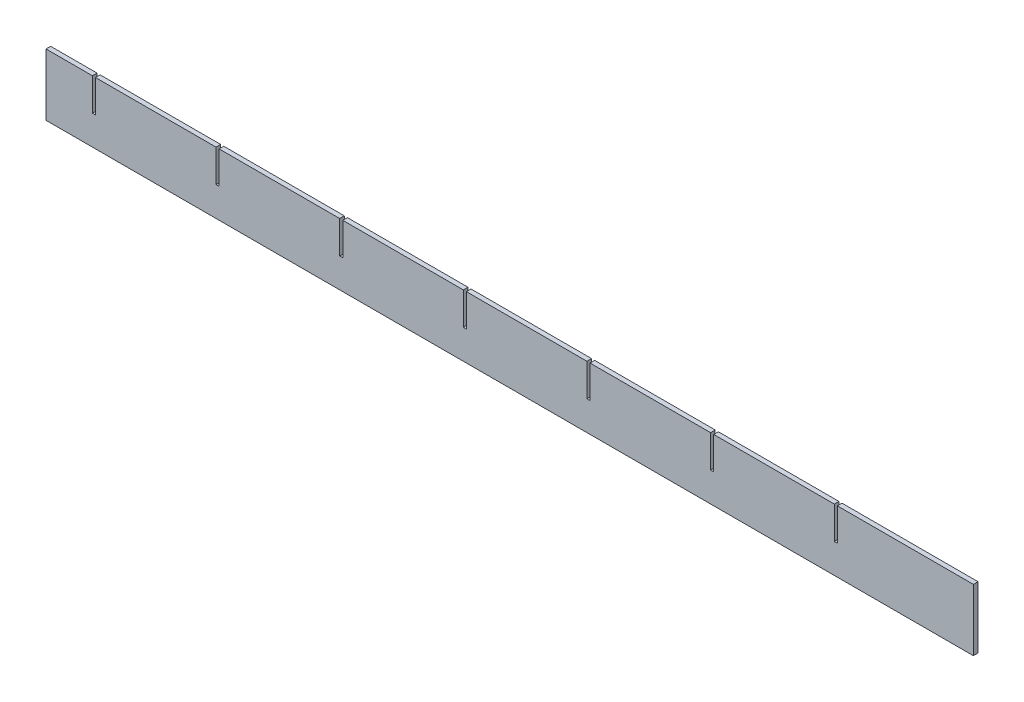
ISO-10303-21;
HEADER;
FILE_DESCRIPTION(('STEP AP214'),'2;1');
FILE_NAME('part.step','',(''),(''),'','','');
FILE_SCHEMA(('AUTOMOTIVE_DESIGN { 1 0 10303 214 1 1 1 1 }'));
ENDSEC;
DATA;
#1=APPLICATION_CONTEXT('core data for automotive mechanical design processes');
#2=APPLICATION_PROTOCOL_DEFINITION('international standard','automotive_design',2000,#1);
#3=PRODUCT_CONTEXT('',#1,'mechanical');
#4=PRODUCT('Part','Part','',(#3));
#5=PRODUCT_RELATED_PRODUCT_CATEGORY('part','',(#4));
#6=PRODUCT_DEFINITION_FORMATION('','',#4);
#7=PRODUCT_DEFINITION_CONTEXT('part definition',#1,'design');
#8=PRODUCT_DEFINITION('design','',#6,#7);
#9=PRODUCT_DEFINITION_SHAPE('','',#8);
#10=(LENGTH_UNIT() NAMED_UNIT(*) SI_UNIT(.MILLI.,.METRE.));
#11=(NAMED_UNIT(*) PLANE_ANGLE_UNIT() SI_UNIT($,.RADIAN.));
#12=(NAMED_UNIT(*) SI_UNIT($,.STERADIAN.) SOLID_ANGLE_UNIT());
#13=UNCERTAINTY_MEASURE_WITH_UNIT(LENGTH_MEASURE(1.E-05),#10,'distance_accuracy_value','');
#14=(GEOMETRIC_REPRESENTATION_CONTEXT(3) GLOBAL_UNCERTAINTY_ASSIGNED_CONTEXT((#13)) GLOBAL_UNIT_ASSIGNED_CONTEXT((#10,
#11,#12)) REPRESENTATION_CONTEXT('',''));
#15=CARTESIAN_POINT('',(0.,0.,0.));
#16=DIRECTION('',(0.,0.,1.));
#17=DIRECTION('',(1.,0.,0.));
#18=AXIS2_PLACEMENT_3D('',#15,#16,#17);
#19=CARTESIAN_POINT('',(0.,20.,3.));
#20=DIRECTION('',(0.,1.,0.));
#21=DIRECTION('',(0.,0.,1.));
#22=AXIS2_PLACEMENT_3D('',#19,#20,#21);
#23=PLANE('',#22);
#24=DIRECTION('',(1.,0.,0.));
#25=VECTOR('',#24,1.);
#26=CARTESIAN_POINT('',(0.,20.,0.));
#27=LINE('',#26,#25);
#28=CARTESIAN_POINT('',(-268.,20.,0.));
#29=VERTEX_POINT('',#28);
#30=CARTESIAN_POINT('',(-190.,20.,0.));
#31=VERTEX_POINT('',#30);
#32=EDGE_CURVE('E290',#29,#31,#27,.T.);
#33=ORIENTED_EDGE('',*,*,#32,.F.);
#34=DIRECTION('',(0.,0.,-1.));
#35=VECTOR('',#34,1.);
#36=CARTESIAN_POINT('',(-268.,20.,3.));
#37=LINE('',#36,#35);
#38=CARTESIAN_POINT('',(-268.,20.,3.));
#39=VERTEX_POINT('',#38);
#40=EDGE_CURVE('E11',#39,#29,#37,.T.);
#41=ORIENTED_EDGE('',*,*,#40,.F.);
#42=DIRECTION('',(1.,0.,0.));
#43=VECTOR('',#42,1.);
#44=CARTESIAN_POINT('',(0.,20.,3.));
#45=LINE('',#44,#43);
#46=CARTESIAN_POINT('',(-190.,20.,3.));
#47=VERTEX_POINT('',#46);
#48=EDGE_CURVE('E413',#39,#47,#45,.T.);
#49=ORIENTED_EDGE('',*,*,#48,.T.);
#50=DIRECTION('',(0.,0.,-1.));
#51=VECTOR('',#50,1.);
#52=CARTESIAN_POINT('',(-190.,20.,3.));
#53=LINE('',#52,#51);
#54=EDGE_CURVE('E64',#47,#31,#53,.T.);
#55=ORIENTED_EDGE('',*,*,#54,.T.);
#56=EDGE_LOOP('',(#33,#41,#49,#55));
#57=FACE_BOUND('',#56,.T.);
#58=ADVANCED_FACE('F47',(#57),#23,.T.);
#59=CARTESIAN_POINT('',(-268.,0.,3.));
#60=DIRECTION('',(1.,0.,0.));
#61=DIRECTION('',(0.,0.,-1.));
#62=AXIS2_PLACEMENT_3D('',#59,#60,#61);
#63=PLANE('',#62);
#64=DIRECTION('',(0.,-1.,0.));
#65=VECTOR('',#64,1.);
#66=CARTESIAN_POINT('',(-268.,0.,0.));
#67=LINE('',#66,#65);
#68=CARTESIAN_POINT('',(-268.,-0.999999999999977,0.));
#69=VERTEX_POINT('',#68);
#70=EDGE_CURVE('E293',#29,#69,#67,.T.);
#71=ORIENTED_EDGE('',*,*,#70,.T.);
#72=DIRECTION('',(0.,0.,-1.));
#73=VECTOR('',#72,1.);
#74=CARTESIAN_POINT('',(-268.,-0.999999999999977,3.));
#75=LINE('',#74,#73);
#76=CARTESIAN_POINT('',(-268.,-0.999999999999977,3.));
#77=VERTEX_POINT('',#76);
#78=EDGE_CURVE('E56',#77,#69,#75,.T.);
#79=ORIENTED_EDGE('',*,*,#78,.F.);
#80=DIRECTION('',(0.,-1.,0.));
#81=VECTOR('',#80,1.);
#82=CARTESIAN_POINT('',(-268.,0.,3.));
#83=LINE('',#82,#81);
#84=EDGE_CURVE('E521',#39,#77,#83,.T.);
#85=ORIENTED_EDGE('',*,*,#84,.F.);
#86=ORIENTED_EDGE('',*,*,#40,.T.);
#87=EDGE_LOOP('',(#71,#79,#85,#86));
#88=FACE_BOUND('',#87,.T.);
#89=ADVANCED_FACE('F508',(#88),#63,.F.);
#90=CARTESIAN_POINT('',(0.,-0.999999999996722,3.));
#91=DIRECTION('',(0.,1.,0.));
#92=DIRECTION('',(-1.,0.,0.));
#93=AXIS2_PLACEMENT_3D('',#90,#91,#92);
#94=PLANE('',#93);
#95=DIRECTION('',(1.,0.,0.));
#96=VECTOR('',#95,1.);
#97=CARTESIAN_POINT('',(0.,-0.999999999996722,0.));
#98=LINE('',#97,#96);
#99=CARTESIAN_POINT('',(-270.,-1.,0.));
#100=VERTEX_POINT('',#99);
#101=EDGE_CURVE('E297',#100,#69,#98,.T.);
#102=ORIENTED_EDGE('',*,*,#101,.F.);
#103=DIRECTION('',(0.,0.,-1.));
#104=VECTOR('',#103,1.);
#105=CARTESIAN_POINT('',(-270.,-1.,3.));
#106=LINE('',#105,#104);
#107=CARTESIAN_POINT('',(-270.,-1.,3.));
#108=VERTEX_POINT('',#107);
#109=EDGE_CURVE('E496',#108,#100,#106,.T.);
#110=ORIENTED_EDGE('',*,*,#109,.F.);
#111=DIRECTION('',(1.,0.,0.));
#112=VECTOR('',#111,1.);
#113=CARTESIAN_POINT('',(0.,-0.999999999996722,3.));
#114=LINE('',#113,#112);
#115=EDGE_CURVE('E505',#108,#77,#114,.T.);
#116=ORIENTED_EDGE('',*,*,#115,.T.);
#117=ORIENTED_EDGE('',*,*,#78,.T.);
#118=EDGE_LOOP('',(#102,#110,#116,#117));
#119=FACE_BOUND('',#118,.T.);
#120=ADVANCED_FACE('F503',(#119),#94,.T.);
#121=CARTESIAN_POINT('',(-270.,0.,3.));
#122=DIRECTION('',(1.,0.,0.));
#123=DIRECTION('',(0.,0.,-1.));
#124=AXIS2_PLACEMENT_3D('',#121,#122,#123);
#125=PLANE('',#124);
#126=DIRECTION('',(0.,-1.,0.));
#127=VECTOR('',#126,1.);
#128=CARTESIAN_POINT('',(-270.,0.,0.));
#129=LINE('',#128,#127);
#130=CARTESIAN_POINT('',(-270.,20.,0.));
#131=VERTEX_POINT('',#130);
#132=EDGE_CURVE('E301',#131,#100,#129,.T.);
#133=ORIENTED_EDGE('',*,*,#132,.F.);
#134=DIRECTION('',(0.,0.,-1.));
#135=VECTOR('',#134,1.);
#136=CARTESIAN_POINT('',(-270.,20.,3.));
#137=LINE('',#136,#135);
#138=CARTESIAN_POINT('',(-270.,20.,3.));
#139=VERTEX_POINT('',#138);
#140=EDGE_CURVE('E493',#139,#131,#137,.T.);
#141=ORIENTED_EDGE('',*,*,#140,.F.);
#142=DIRECTION('',(0.,-1.,0.));
#143=VECTOR('',#142,1.);
#144=CARTESIAN_POINT('',(-270.,0.,3.));
#145=LINE('',#144,#143);
#146=EDGE_CURVE('E518',#139,#108,#145,.T.);
#147=ORIENTED_EDGE('',*,*,#146,.T.);
#148=ORIENTED_EDGE('',*,*,#109,.T.);
#149=EDGE_LOOP('',(#133,#141,#147,#148));
#150=FACE_BOUND('',#149,.T.);
#151=ADVANCED_FACE('F515',(#150),#125,.T.);
#152=CARTESIAN_POINT('',(0.,20.0000000000002,3.));
#153=DIRECTION('',(0.,1.,0.));
#154=DIRECTION('',(-1.,0.,0.));
#155=AXIS2_PLACEMENT_3D('',#152,#153,#154);
#156=PLANE('',#155);
#157=DIRECTION('',(1.,0.,0.));
#158=VECTOR('',#157,1.);
#159=CARTESIAN_POINT('',(0.,20.0000000000002,0.));
#160=LINE('',#159,#158);
#161=CARTESIAN_POINT('',(-300.,20.,0.));
#162=VERTEX_POINT('',#161);
#163=EDGE_CURVE('E305',#162,#131,#160,.T.);
#164=ORIENTED_EDGE('',*,*,#163,.F.);
#165=DIRECTION('',(0.,0.,-1.));
#166=VECTOR('',#165,1.);
#167=CARTESIAN_POINT('',(-300.,20.,3.));
#168=LINE('',#167,#166);
#169=CARTESIAN_POINT('',(-300.,20.,3.));
#170=VERTEX_POINT('',#169);
#171=EDGE_CURVE('E490',#170,#162,#168,.T.);
#172=ORIENTED_EDGE('',*,*,#171,.F.);
#173=DIRECTION('',(1.,0.,0.));
#174=VECTOR('',#173,1.);
#175=CARTESIAN_POINT('',(0.,20.0000000000002,3.));
#176=LINE('',#175,#174);
#177=EDGE_CURVE('E526',#170,#139,#176,.T.);
#178=ORIENTED_EDGE('',*,*,#177,.T.);
#179=ORIENTED_EDGE('',*,*,#140,.T.);
#180=EDGE_LOOP('',(#164,#172,#178,#179));
#181=FACE_BOUND('',#180,.T.);
#182=ADVANCED_FACE('F643',(#181),#156,.T.);
#183=CARTESIAN_POINT('',(-300.,0.,3.));
#184=DIRECTION('',(1.,0.,0.));
#185=DIRECTION('',(0.,0.,-1.));
#186=AXIS2_PLACEMENT_3D('',#183,#184,#185);
#187=PLANE('',#186);
#188=DIRECTION('',(0.,-1.,0.));
#189=VECTOR('',#188,1.);
#190=CARTESIAN_POINT('',(-300.,0.,0.));
#191=LINE('',#190,#189);
#192=CARTESIAN_POINT('',(-300.,-20.,0.));
#193=VERTEX_POINT('',#192);
#194=EDGE_CURVE('E309',#162,#193,#191,.T.);
#195=ORIENTED_EDGE('',*,*,#194,.T.);
#196=DIRECTION('',(0.,0.,-1.));
#197=VECTOR('',#196,1.);
#198=CARTESIAN_POINT('',(-300.,-20.,3.));
#199=LINE('',#198,#197);
#200=CARTESIAN_POINT('',(-300.,-20.,3.));
#201=VERTEX_POINT('',#200);
#202=EDGE_CURVE('E486',#201,#193,#199,.T.);
#203=ORIENTED_EDGE('',*,*,#202,.F.);
#204=DIRECTION('',(0.,-1.,0.));
#205=VECTOR('',#204,1.);
#206=CARTESIAN_POINT('',(-300.,0.,3.));
#207=LINE('',#206,#205);
#208=EDGE_CURVE('E533',#170,#201,#207,.T.);
#209=ORIENTED_EDGE('',*,*,#208,.F.);
#210=ORIENTED_EDGE('',*,*,#171,.T.);
#211=EDGE_LOOP('',(#195,#203,#209,#210));
#212=FACE_BOUND('',#211,.T.);
#213=ADVANCED_FACE('F646',(#212),#187,.F.);
#214=CARTESIAN_POINT('',(0.,-20.,3.));
#215=DIRECTION('',(0.,1.,0.));
#216=DIRECTION('',(0.,0.,1.));
#217=AXIS2_PLACEMENT_3D('',#214,#215,#216);
#218=PLANE('',#217);
#219=DIRECTION('',(1.,0.,0.));
#220=VECTOR('',#219,1.);
#221=CARTESIAN_POINT('',(0.,-20.,0.));
#222=LINE('',#221,#220);
#223=CARTESIAN_POINT('',(300.,-20.,0.));
#224=VERTEX_POINT('',#223);
#225=EDGE_CURVE('E312',#193,#224,#222,.T.);
#226=ORIENTED_EDGE('',*,*,#225,.T.);
#227=DIRECTION('',(0.,0.,-1.));
#228=VECTOR('',#227,1.);
#229=CARTESIAN_POINT('',(300.,-20.,3.));
#230=LINE('',#229,#228);
#231=CARTESIAN_POINT('',(300.,-20.,3.));
#232=VERTEX_POINT('',#231);
#233=EDGE_CURVE('E483',#232,#224,#230,.T.);
#234=ORIENTED_EDGE('',*,*,#233,.F.);
#235=DIRECTION('',(1.,0.,0.));
#236=VECTOR('',#235,1.);
#237=CARTESIAN_POINT('',(0.,-20.,3.));
#238=LINE('',#237,#236);
#239=EDGE_CURVE('E536',#201,#232,#238,.T.);
#240=ORIENTED_EDGE('',*,*,#239,.F.);
#241=ORIENTED_EDGE('',*,*,#202,.T.);
#242=EDGE_LOOP('',(#226,#234,#240,#241));
#243=FACE_BOUND('',#242,.T.);
#244=ADVANCED_FACE('F650',(#243),#218,.F.);
#245=CARTESIAN_POINT('',(300.,0.,3.));
#246=DIRECTION('',(1.,0.,0.));
#247=DIRECTION('',(0.,0.,-1.));
#248=AXIS2_PLACEMENT_3D('',#245,#246,#247);
#249=PLANE('',#248);
#250=DIRECTION('',(0.,-1.,0.));
#251=VECTOR('',#250,1.);
#252=CARTESIAN_POINT('',(300.,0.,0.));
#253=LINE('',#252,#251);
#254=CARTESIAN_POINT('',(300.,20.,0.));
#255=VERTEX_POINT('',#254);
#256=EDGE_CURVE('E316',#255,#224,#253,.T.);
#257=ORIENTED_EDGE('',*,*,#256,.F.);
#258=DIRECTION('',(0.,0.,-1.));
#259=VECTOR('',#258,1.);
#260=CARTESIAN_POINT('',(300.,20.,3.));
#261=LINE('',#260,#259);
#262=CARTESIAN_POINT('',(300.,20.,3.));
#263=VERTEX_POINT('',#262);
#264=EDGE_CURVE('E480',#263,#255,#261,.T.);
#265=ORIENTED_EDGE('',*,*,#264,.F.);
#266=DIRECTION('',(0.,-1.,0.));
#267=VECTOR('',#266,1.);
#268=CARTESIAN_POINT('',(300.,0.,3.));
#269=LINE('',#268,#267);
#270=EDGE_CURVE('E539',#263,#232,#269,.T.);
#271=ORIENTED_EDGE('',*,*,#270,.T.);
#272=ORIENTED_EDGE('',*,*,#233,.T.);
#273=EDGE_LOOP('',(#257,#265,#271,#272));
#274=FACE_BOUND('',#273,.T.);
#275=ADVANCED_FACE('F654',(#274),#249,.T.);
#276=CARTESIAN_POINT('',(0.,20.0000000000001,3.));
#277=DIRECTION('',(0.,1.,0.));
#278=DIRECTION('',(-1.,0.,0.));
#279=AXIS2_PLACEMENT_3D('',#276,#277,#278);
#280=PLANE('',#279);
#281=DIRECTION('',(1.,0.,0.));
#282=VECTOR('',#281,1.);
#283=CARTESIAN_POINT('',(0.,20.0000000000001,0.));
#284=LINE('',#283,#282);
#285=CARTESIAN_POINT('',(212.,20.,0.));
#286=VERTEX_POINT('',#285);
#287=EDGE_CURVE('E320',#286,#255,#284,.T.);
#288=ORIENTED_EDGE('',*,*,#287,.F.);
#289=DIRECTION('',(0.,0.,-1.));
#290=VECTOR('',#289,1.);
#291=CARTESIAN_POINT('',(212.,20.,3.));
#292=LINE('',#291,#290);
#293=CARTESIAN_POINT('',(212.,20.,3.));
#294=VERTEX_POINT('',#293);
#295=EDGE_CURVE('E477',#294,#286,#292,.T.);
#296=ORIENTED_EDGE('',*,*,#295,.F.);
#297=DIRECTION('',(1.,0.,0.));
#298=VECTOR('',#297,1.);
#299=CARTESIAN_POINT('',(0.,20.0000000000001,3.));
#300=LINE('',#299,#298);
#301=EDGE_CURVE('E543',#294,#263,#300,.T.);
#302=ORIENTED_EDGE('',*,*,#301,.T.);
#303=ORIENTED_EDGE('',*,*,#264,.T.);
#304=EDGE_LOOP('',(#288,#296,#302,#303));
#305=FACE_BOUND('',#304,.T.);
#306=ADVANCED_FACE('F658',(#305),#280,.T.);
#307=CARTESIAN_POINT('',(212.,0.,3.));
#308=DIRECTION('',(1.,0.,0.));
#309=DIRECTION('',(0.,0.,-1.));
#310=AXIS2_PLACEMENT_3D('',#307,#308,#309);
#311=PLANE('',#310);
#312=DIRECTION('',(0.,-1.,0.));
#313=VECTOR('',#312,1.);
#314=CARTESIAN_POINT('',(212.,0.,0.));
#315=LINE('',#314,#313);
#316=CARTESIAN_POINT('',(212.,-0.999999999999977,0.));
#317=VERTEX_POINT('',#316);
#318=EDGE_CURVE('E324',#286,#317,#315,.T.);
#319=ORIENTED_EDGE('',*,*,#318,.T.);
#320=DIRECTION('',(0.,0.,-1.));
#321=VECTOR('',#320,1.);
#322=CARTESIAN_POINT('',(212.,-0.999999999999977,3.));
#323=LINE('',#322,#321);
#324=CARTESIAN_POINT('',(212.,-0.999999999999977,3.));
#325=VERTEX_POINT('',#324);
#326=EDGE_CURVE('E474',#325,#317,#323,.T.);
#327=ORIENTED_EDGE('',*,*,#326,.F.);
#328=DIRECTION('',(0.,-1.,0.));
#329=VECTOR('',#328,1.);
#330=CARTESIAN_POINT('',(212.,0.,3.));
#331=LINE('',#330,#329);
#332=EDGE_CURVE('E547',#294,#325,#331,.T.);
#333=ORIENTED_EDGE('',*,*,#332,.F.);
#334=ORIENTED_EDGE('',*,*,#295,.T.);
#335=EDGE_LOOP('',(#319,#327,#333,#334));
#336=FACE_BOUND('',#335,.T.);
#337=ADVANCED_FACE('F662',(#336),#311,.F.);
#338=CARTESIAN_POINT('',(0.,-1.00000000000255,3.));
#339=DIRECTION('',(0.,1.,0.));
#340=DIRECTION('',(-1.,0.,0.));
#341=AXIS2_PLACEMENT_3D('',#338,#339,#340);
#342=PLANE('',#341);
#343=DIRECTION('',(1.,0.,0.));
#344=VECTOR('',#343,1.);
#345=CARTESIAN_POINT('',(0.,-1.00000000000255,0.));
#346=LINE('',#345,#344);
#347=CARTESIAN_POINT('',(210.,-1.,0.));
#348=VERTEX_POINT('',#347);
#349=EDGE_CURVE('E328',#348,#317,#346,.T.);
#350=ORIENTED_EDGE('',*,*,#349,.F.);
#351=DIRECTION('',(0.,0.,-1.));
#352=VECTOR('',#351,1.);
#353=CARTESIAN_POINT('',(210.,-1.,3.));
#354=LINE('',#353,#352);
#355=CARTESIAN_POINT('',(210.,-1.,3.));
#356=VERTEX_POINT('',#355);
#357=EDGE_CURVE('E471',#356,#348,#354,.T.);
#358=ORIENTED_EDGE('',*,*,#357,.F.);
#359=DIRECTION('',(1.,0.,0.));
#360=VECTOR('',#359,1.);
#361=CARTESIAN_POINT('',(0.,-1.00000000000255,3.));
#362=LINE('',#361,#360);
#363=EDGE_CURVE('E550',#356,#325,#362,.T.);
#364=ORIENTED_EDGE('',*,*,#363,.T.);
#365=ORIENTED_EDGE('',*,*,#326,.T.);
#366=EDGE_LOOP('',(#350,#358,#364,#365));
#367=FACE_BOUND('',#366,.T.);
#368=ADVANCED_FACE('F666',(#367),#342,.T.);
#369=CARTESIAN_POINT('',(210.,0.,3.));
#370=DIRECTION('',(1.,0.,0.));
#371=DIRECTION('',(0.,0.,-1.));
#372=AXIS2_PLACEMENT_3D('',#369,#370,#371);
#373=PLANE('',#372);
#374=DIRECTION('',(0.,-1.,0.));
#375=VECTOR('',#374,1.);
#376=CARTESIAN_POINT('',(210.,0.,0.));
#377=LINE('',#376,#375);
#378=CARTESIAN_POINT('',(210.,20.,0.));
#379=VERTEX_POINT('',#378);
#380=EDGE_CURVE('E332',#379,#348,#377,.T.);
#381=ORIENTED_EDGE('',*,*,#380,.F.);
#382=DIRECTION('',(0.,0.,-1.));
#383=VECTOR('',#382,1.);
#384=CARTESIAN_POINT('',(210.,20.,3.));
#385=LINE('',#384,#383);
#386=CARTESIAN_POINT('',(210.,20.,3.));
#387=VERTEX_POINT('',#386);
#388=EDGE_CURVE('E468',#387,#379,#385,.T.);
#389=ORIENTED_EDGE('',*,*,#388,.F.);
#390=DIRECTION('',(0.,-1.,0.));
#391=VECTOR('',#390,1.);
#392=CARTESIAN_POINT('',(210.,0.,3.));
#393=LINE('',#392,#391);
#394=EDGE_CURVE('E554',#387,#356,#393,.T.);
#395=ORIENTED_EDGE('',*,*,#394,.T.);
#396=ORIENTED_EDGE('',*,*,#357,.T.);
#397=EDGE_LOOP('',(#381,#389,#395,#396));
#398=FACE_BOUND('',#397,.T.);
#399=ADVANCED_FACE('F670',(#398),#373,.T.);
#400=CARTESIAN_POINT('',(0.,20.,3.));
#401=DIRECTION('',(0.,1.,0.));
#402=DIRECTION('',(0.,0.,1.));
#403=AXIS2_PLACEMENT_3D('',#400,#401,#402);
#404=PLANE('',#403);
#405=DIRECTION('',(1.,0.,0.));
#406=VECTOR('',#405,1.);
#407=CARTESIAN_POINT('',(0.,20.,0.));
#408=LINE('',#407,#406);
#409=CARTESIAN_POINT('',(132.,20.,0.));
#410=VERTEX_POINT('',#409);
#411=EDGE_CURVE('E336',#410,#379,#408,.T.);
#412=ORIENTED_EDGE('',*,*,#411,.F.);
#413=DIRECTION('',(0.,0.,-1.));
#414=VECTOR('',#413,1.);
#415=CARTESIAN_POINT('',(132.,20.,3.));
#416=LINE('',#415,#414);
#417=CARTESIAN_POINT('',(132.,20.,3.));
#418=VERTEX_POINT('',#417);
#419=EDGE_CURVE('E465',#418,#410,#416,.T.);
#420=ORIENTED_EDGE('',*,*,#419,.F.);
#421=DIRECTION('',(1.,0.,0.));
#422=VECTOR('',#421,1.);
#423=CARTESIAN_POINT('',(0.,20.,3.));
#424=LINE('',#423,#422);
#425=EDGE_CURVE('E558',#418,#387,#424,.T.);
#426=ORIENTED_EDGE('',*,*,#425,.T.);
#427=ORIENTED_EDGE('',*,*,#388,.T.);
#428=EDGE_LOOP('',(#412,#420,#426,#427));
#429=FACE_BOUND('',#428,.T.);
#430=ADVANCED_FACE('F674',(#429),#404,.T.);
#431=CARTESIAN_POINT('',(132.,0.,3.));
#432=DIRECTION('',(1.,0.,0.));
#433=DIRECTION('',(0.,0.,-1.));
#434=AXIS2_PLACEMENT_3D('',#431,#432,#433);
#435=PLANE('',#434);
#436=DIRECTION('',(0.,-1.,0.));
#437=VECTOR('',#436,1.);
#438=CARTESIAN_POINT('',(132.,0.,0.));
#439=LINE('',#438,#437);
#440=CARTESIAN_POINT('',(132.,-0.999999999999977,0.));
#441=VERTEX_POINT('',#440);
#442=EDGE_CURVE('E340',#410,#441,#439,.T.);
#443=ORIENTED_EDGE('',*,*,#442,.T.);
#444=DIRECTION('',(0.,0.,-1.));
#445=VECTOR('',#444,1.);
#446=CARTESIAN_POINT('',(132.,-0.999999999999977,3.));
#447=LINE('',#446,#445);
#448=CARTESIAN_POINT('',(132.,-0.999999999999977,3.));
#449=VERTEX_POINT('',#448);
#450=EDGE_CURVE('E462',#449,#441,#447,.T.);
#451=ORIENTED_EDGE('',*,*,#450,.F.);
#452=DIRECTION('',(0.,-1.,0.));
#453=VECTOR('',#452,1.);
#454=CARTESIAN_POINT('',(132.,0.,3.));
#455=LINE('',#454,#453);
#456=EDGE_CURVE('E562',#418,#449,#455,.T.);
#457=ORIENTED_EDGE('',*,*,#456,.F.);
#458=ORIENTED_EDGE('',*,*,#419,.T.);
#459=EDGE_LOOP('',(#443,#451,#457,#458));
#460=FACE_BOUND('',#459,.T.);
#461=ADVANCED_FACE('F678',(#460),#435,.F.);
#462=CARTESIAN_POINT('',(0.,-1.00000000000158,3.));
#463=DIRECTION('',(0.,1.,0.));
#464=DIRECTION('',(-1.,0.,0.));
#465=AXIS2_PLACEMENT_3D('',#462,#463,#464);
#466=PLANE('',#465);
#467=DIRECTION('',(1.,0.,0.));
#468=VECTOR('',#467,1.);
#469=CARTESIAN_POINT('',(0.,-1.00000000000158,0.));
#470=LINE('',#469,#468);
#471=CARTESIAN_POINT('',(130.,-1.,0.));
#472=VERTEX_POINT('',#471);
#473=EDGE_CURVE('E344',#472,#441,#470,.T.);
#474=ORIENTED_EDGE('',*,*,#473,.F.);
#475=DIRECTION('',(0.,0.,-1.));
#476=VECTOR('',#475,1.);
#477=CARTESIAN_POINT('',(130.,-1.,3.));
#478=LINE('',#477,#476);
#479=CARTESIAN_POINT('',(130.,-1.,3.));
#480=VERTEX_POINT('',#479);
#481=EDGE_CURVE('E459',#480,#472,#478,.T.);
#482=ORIENTED_EDGE('',*,*,#481,.F.);
#483=DIRECTION('',(1.,0.,0.));
#484=VECTOR('',#483,1.);
#485=CARTESIAN_POINT('',(0.,-1.00000000000158,3.));
#486=LINE('',#485,#484);
#487=EDGE_CURVE('E565',#480,#449,#486,.T.);
#488=ORIENTED_EDGE('',*,*,#487,.T.);
#489=ORIENTED_EDGE('',*,*,#450,.T.);
#490=EDGE_LOOP('',(#474,#482,#488,#489));
#491=FACE_BOUND('',#490,.T.);
#492=ADVANCED_FACE('F682',(#491),#466,.T.);
#493=CARTESIAN_POINT('',(130.,0.,3.));
#494=DIRECTION('',(1.,0.,0.));
#495=DIRECTION('',(0.,0.,-1.));
#496=AXIS2_PLACEMENT_3D('',#493,#494,#495);
#497=PLANE('',#496);
#498=DIRECTION('',(0.,-1.,0.));
#499=VECTOR('',#498,1.);
#500=CARTESIAN_POINT('',(130.,0.,0.));
#501=LINE('',#500,#499);
#502=CARTESIAN_POINT('',(130.,20.,0.));
#503=VERTEX_POINT('',#502);
#504=EDGE_CURVE('E348',#503,#472,#501,.T.);
#505=ORIENTED_EDGE('',*,*,#504,.F.);
#506=DIRECTION('',(0.,0.,-1.));
#507=VECTOR('',#506,1.);
#508=CARTESIAN_POINT('',(130.,20.,3.));
#509=LINE('',#508,#507);
#510=CARTESIAN_POINT('',(130.,20.,3.));
#511=VERTEX_POINT('',#510);
#512=EDGE_CURVE('E456',#511,#503,#509,.T.);
#513=ORIENTED_EDGE('',*,*,#512,.F.);
#514=DIRECTION('',(0.,-1.,0.));
#515=VECTOR('',#514,1.);
#516=CARTESIAN_POINT('',(130.,0.,3.));
#517=LINE('',#516,#515);
#518=EDGE_CURVE('E569',#511,#480,#517,.T.);
#519=ORIENTED_EDGE('',*,*,#518,.T.);
#520=ORIENTED_EDGE('',*,*,#481,.T.);
#521=EDGE_LOOP('',(#505,#513,#519,#520));
#522=FACE_BOUND('',#521,.T.);
#523=ADVANCED_FACE('F686',(#522),#497,.T.);
#524=CARTESIAN_POINT('',(0.,20.,3.));
#525=DIRECTION('',(0.,1.,0.));
#526=DIRECTION('',(0.,0.,1.));
#527=AXIS2_PLACEMENT_3D('',#524,#525,#526);
#528=PLANE('',#527);
#529=DIRECTION('',(1.,0.,0.));
#530=VECTOR('',#529,1.);
#531=CARTESIAN_POINT('',(0.,20.,0.));
#532=LINE('',#531,#530);
#533=CARTESIAN_POINT('',(52.,20.,0.));
#534=VERTEX_POINT('',#533);
#535=EDGE_CURVE('E352',#534,#503,#532,.T.);
#536=ORIENTED_EDGE('',*,*,#535,.F.);
#537=DIRECTION('',(0.,0.,-1.));
#538=VECTOR('',#537,1.);
#539=CARTESIAN_POINT('',(52.,20.,3.));
#540=LINE('',#539,#538);
#541=CARTESIAN_POINT('',(52.,20.,3.));
#542=VERTEX_POINT('',#541);
#543=EDGE_CURVE('E453',#542,#534,#540,.T.);
#544=ORIENTED_EDGE('',*,*,#543,.F.);
#545=DIRECTION('',(1.,0.,0.));
#546=VECTOR('',#545,1.);
#547=CARTESIAN_POINT('',(0.,20.,3.));
#548=LINE('',#547,#546);
#549=EDGE_CURVE('E573',#542,#511,#548,.T.);
#550=ORIENTED_EDGE('',*,*,#549,.T.);
#551=ORIENTED_EDGE('',*,*,#512,.T.);
#552=EDGE_LOOP('',(#536,#544,#550,#551));
#553=FACE_BOUND('',#552,.T.);
#554=ADVANCED_FACE('F690',(#553),#528,.T.);
#555=CARTESIAN_POINT('',(52.,0.,3.));
#556=DIRECTION('',(1.,0.,0.));
#557=DIRECTION('',(0.,0.,-1.));
#558=AXIS2_PLACEMENT_3D('',#555,#556,#557);
#559=PLANE('',#558);
#560=DIRECTION('',(0.,-1.,0.));
#561=VECTOR('',#560,1.);
#562=CARTESIAN_POINT('',(52.,0.,0.));
#563=LINE('',#562,#561);
#564=CARTESIAN_POINT('',(52.,-0.999999999999977,0.));
#565=VERTEX_POINT('',#564);
#566=EDGE_CURVE('E356',#534,#565,#563,.T.);
#567=ORIENTED_EDGE('',*,*,#566,.T.);
#568=DIRECTION('',(0.,0.,-1.));
#569=VECTOR('',#568,1.);
#570=CARTESIAN_POINT('',(52.,-0.999999999999977,3.));
#571=LINE('',#570,#569);
#572=CARTESIAN_POINT('',(52.,-0.999999999999977,3.));
#573=VERTEX_POINT('',#572);
#574=EDGE_CURVE('E450',#573,#565,#571,.T.);
#575=ORIENTED_EDGE('',*,*,#574,.F.);
#576=DIRECTION('',(0.,-1.,0.));
#577=VECTOR('',#576,1.);
#578=CARTESIAN_POINT('',(52.,0.,3.));
#579=LINE('',#578,#577);
#580=EDGE_CURVE('E577',#542,#573,#579,.T.);
#581=ORIENTED_EDGE('',*,*,#580,.F.);
#582=ORIENTED_EDGE('',*,*,#543,.T.);
#583=EDGE_LOOP('',(#567,#575,#581,#582));
#584=FACE_BOUND('',#583,.T.);
#585=ADVANCED_FACE('F694',(#584),#559,.F.);
#586=CARTESIAN_POINT('',(0.,-1.00000000000061,3.));
#587=DIRECTION('',(0.,1.,0.));
#588=DIRECTION('',(-1.,0.,0.));
#589=AXIS2_PLACEMENT_3D('',#586,#587,#588);
#590=PLANE('',#589);
#591=DIRECTION('',(1.,0.,0.));
#592=VECTOR('',#591,1.);
#593=CARTESIAN_POINT('',(0.,-1.00000000000061,0.));
#594=LINE('',#593,#592);
#595=CARTESIAN_POINT('',(50.,-1.,0.));
#596=VERTEX_POINT('',#595);
#597=EDGE_CURVE('E360',#596,#565,#594,.T.);
#598=ORIENTED_EDGE('',*,*,#597,.F.);
#599=DIRECTION('',(0.,0.,-1.));
#600=VECTOR('',#599,1.);
#601=CARTESIAN_POINT('',(50.,-1.,3.));
#602=LINE('',#601,#600);
#603=CARTESIAN_POINT('',(50.,-1.,3.));
#604=VERTEX_POINT('',#603);
#605=EDGE_CURVE('E447',#604,#596,#602,.T.);
#606=ORIENTED_EDGE('',*,*,#605,.F.);
#607=DIRECTION('',(1.,0.,0.));
#608=VECTOR('',#607,1.);
#609=CARTESIAN_POINT('',(0.,-1.00000000000061,3.));
#610=LINE('',#609,#608);
#611=EDGE_CURVE('E580',#604,#573,#610,.T.);
#612=ORIENTED_EDGE('',*,*,#611,.T.);
#613=ORIENTED_EDGE('',*,*,#574,.T.);
#614=EDGE_LOOP('',(#598,#606,#612,#613));
#615=FACE_BOUND('',#614,.T.);
#616=ADVANCED_FACE('F698',(#615),#590,.T.);
#617=CARTESIAN_POINT('',(50.,0.,3.));
#618=DIRECTION('',(1.,0.,0.));
#619=DIRECTION('',(0.,0.,-1.));
#620=AXIS2_PLACEMENT_3D('',#617,#618,#619);
#621=PLANE('',#620);
#622=DIRECTION('',(0.,-1.,0.));
#623=VECTOR('',#622,1.);
#624=CARTESIAN_POINT('',(50.,0.,0.));
#625=LINE('',#624,#623);
#626=CARTESIAN_POINT('',(50.,20.,0.));
#627=VERTEX_POINT('',#626);
#628=EDGE_CURVE('E364',#627,#596,#625,.T.);
#629=ORIENTED_EDGE('',*,*,#628,.F.);
#630=DIRECTION('',(0.,0.,-1.));
#631=VECTOR('',#630,1.);
#632=CARTESIAN_POINT('',(50.,20.,3.));
#633=LINE('',#632,#631);
#634=CARTESIAN_POINT('',(50.,20.,3.));
#635=VERTEX_POINT('',#634);
#636=EDGE_CURVE('E444',#635,#627,#633,.T.);
#637=ORIENTED_EDGE('',*,*,#636,.F.);
#638=DIRECTION('',(0.,-1.,0.));
#639=VECTOR('',#638,1.);
#640=CARTESIAN_POINT('',(50.,0.,3.));
#641=LINE('',#640,#639);
#642=EDGE_CURVE('E584',#635,#604,#641,.T.);
#643=ORIENTED_EDGE('',*,*,#642,.T.);
#644=ORIENTED_EDGE('',*,*,#605,.T.);
#645=EDGE_LOOP('',(#629,#637,#643,#644));
#646=FACE_BOUND('',#645,.T.);
#647=ADVANCED_FACE('F702',(#646),#621,.T.);
#648=CARTESIAN_POINT('',(0.,20.,3.));
#649=DIRECTION('',(0.,1.,0.));
#650=DIRECTION('',(0.,0.,1.));
#651=AXIS2_PLACEMENT_3D('',#648,#649,#650);
#652=PLANE('',#651);
#653=DIRECTION('',(1.,0.,0.));
#654=VECTOR('',#653,1.);
#655=CARTESIAN_POINT('',(0.,20.,0.));
#656=LINE('',#655,#654);
#657=CARTESIAN_POINT('',(-28.,20.,0.));
#658=VERTEX_POINT('',#657);
#659=EDGE_CURVE('E368',#658,#627,#656,.T.);
#660=ORIENTED_EDGE('',*,*,#659,.F.);
#661=DIRECTION('',(0.,0.,-1.));
#662=VECTOR('',#661,1.);
#663=CARTESIAN_POINT('',(-28.,20.,3.));
#664=LINE('',#663,#662);
#665=CARTESIAN_POINT('',(-28.,20.,3.));
#666=VERTEX_POINT('',#665);
#667=EDGE_CURVE('E441',#666,#658,#664,.T.);
#668=ORIENTED_EDGE('',*,*,#667,.F.);
#669=DIRECTION('',(1.,0.,0.));
#670=VECTOR('',#669,1.);
#671=CARTESIAN_POINT('',(0.,20.,3.));
#672=LINE('',#671,#670);
#673=EDGE_CURVE('E588',#666,#635,#672,.T.);
#674=ORIENTED_EDGE('',*,*,#673,.T.);
#675=ORIENTED_EDGE('',*,*,#636,.T.);
#676=EDGE_LOOP('',(#660,#668,#674,#675));
#677=FACE_BOUND('',#676,.T.);
#678=ADVANCED_FACE('F706',(#677),#652,.T.);
#679=CARTESIAN_POINT('',(-28.,0.,3.));
#680=DIRECTION('',(1.,0.,0.));
#681=DIRECTION('',(0.,0.,-1.));
#682=AXIS2_PLACEMENT_3D('',#679,#680,#681);
#683=PLANE('',#682);
#684=DIRECTION('',(0.,-1.,0.));
#685=VECTOR('',#684,1.);
#686=CARTESIAN_POINT('',(-28.,0.,0.));
#687=LINE('',#686,#685);
#688=CARTESIAN_POINT('',(-28.,-0.999999999999977,0.));
#689=VERTEX_POINT('',#688);
#690=EDGE_CURVE('E372',#658,#689,#687,.T.);
#691=ORIENTED_EDGE('',*,*,#690,.T.);
#692=DIRECTION('',(0.,0.,-1.));
#693=VECTOR('',#692,1.);
#694=CARTESIAN_POINT('',(-28.,-0.999999999999977,3.));
#695=LINE('',#694,#693);
#696=CARTESIAN_POINT('',(-28.,-0.999999999999977,3.));
#697=VERTEX_POINT('',#696);
#698=EDGE_CURVE('E438',#697,#689,#695,.T.);
#699=ORIENTED_EDGE('',*,*,#698,.F.);
#700=DIRECTION('',(0.,-1.,0.));
#701=VECTOR('',#700,1.);
#702=CARTESIAN_POINT('',(-28.,0.,3.));
#703=LINE('',#702,#701);
#704=EDGE_CURVE('E592',#666,#697,#703,.T.);
#705=ORIENTED_EDGE('',*,*,#704,.F.);
#706=ORIENTED_EDGE('',*,*,#667,.T.);
#707=EDGE_LOOP('',(#691,#699,#705,#706));
#708=FACE_BOUND('',#707,.T.);
#709=ADVANCED_FACE('F710',(#708),#683,.F.);
#710=CARTESIAN_POINT('',(0.,-0.999999999999637,3.));
#711=DIRECTION('',(0.,1.,0.));
#712=DIRECTION('',(-1.,0.,0.));
#713=AXIS2_PLACEMENT_3D('',#710,#711,#712);
#714=PLANE('',#713);
#715=DIRECTION('',(1.,0.,0.));
#716=VECTOR('',#715,1.);
#717=CARTESIAN_POINT('',(0.,-0.999999999999637,0.));
#718=LINE('',#717,#716);
#719=CARTESIAN_POINT('',(-30.,-1.,0.));
#720=VERTEX_POINT('',#719);
#721=EDGE_CURVE('E376',#720,#689,#718,.T.);
#722=ORIENTED_EDGE('',*,*,#721,.F.);
#723=DIRECTION('',(0.,0.,-1.));
#724=VECTOR('',#723,1.);
#725=CARTESIAN_POINT('',(-30.,-1.,3.));
#726=LINE('',#725,#724);
#727=CARTESIAN_POINT('',(-30.,-1.,3.));
#728=VERTEX_POINT('',#727);
#729=EDGE_CURVE('E435',#728,#720,#726,.T.);
#730=ORIENTED_EDGE('',*,*,#729,.F.);
#731=DIRECTION('',(1.,0.,0.));
#732=VECTOR('',#731,1.);
#733=CARTESIAN_POINT('',(0.,-0.999999999999637,3.));
#734=LINE('',#733,#732);
#735=EDGE_CURVE('E595',#728,#697,#734,.T.);
#736=ORIENTED_EDGE('',*,*,#735,.T.);
#737=ORIENTED_EDGE('',*,*,#698,.T.);
#738=EDGE_LOOP('',(#722,#730,#736,#737));
#739=FACE_BOUND('',#738,.T.);
#740=ADVANCED_FACE('F714',(#739),#714,.T.);
#741=CARTESIAN_POINT('',(-30.,0.,3.));
#742=DIRECTION('',(1.,0.,0.));
#743=DIRECTION('',(0.,0.,-1.));
#744=AXIS2_PLACEMENT_3D('',#741,#742,#743);
#745=PLANE('',#744);
#746=DIRECTION('',(0.,-1.,0.));
#747=VECTOR('',#746,1.);
#748=CARTESIAN_POINT('',(-30.,0.,0.));
#749=LINE('',#748,#747);
#750=CARTESIAN_POINT('',(-30.,20.,0.));
#751=VERTEX_POINT('',#750);
#752=EDGE_CURVE('E380',#751,#720,#749,.T.);
#753=ORIENTED_EDGE('',*,*,#752,.F.);
#754=DIRECTION('',(0.,0.,-1.));
#755=VECTOR('',#754,1.);
#756=CARTESIAN_POINT('',(-30.,20.,3.));
#757=LINE('',#756,#755);
#758=CARTESIAN_POINT('',(-30.,20.,3.));
#759=VERTEX_POINT('',#758);
#760=EDGE_CURVE('E432',#759,#751,#757,.T.);
#761=ORIENTED_EDGE('',*,*,#760,.F.);
#762=DIRECTION('',(0.,-1.,0.));
#763=VECTOR('',#762,1.);
#764=CARTESIAN_POINT('',(-30.,0.,3.));
#765=LINE('',#764,#763);
#766=EDGE_CURVE('E599',#759,#728,#765,.T.);
#767=ORIENTED_EDGE('',*,*,#766,.T.);
#768=ORIENTED_EDGE('',*,*,#729,.T.);
#769=EDGE_LOOP('',(#753,#761,#767,#768));
#770=FACE_BOUND('',#769,.T.);
#771=ADVANCED_FACE('F718',(#770),#745,.T.);
#772=CARTESIAN_POINT('',(0.,20.,3.));
#773=DIRECTION('',(0.,1.,0.));
#774=DIRECTION('',(0.,0.,1.));
#775=AXIS2_PLACEMENT_3D('',#772,#773,#774);
#776=PLANE('',#775);
#777=DIRECTION('',(1.,0.,0.));
#778=VECTOR('',#777,1.);
#779=CARTESIAN_POINT('',(0.,20.,0.));
#780=LINE('',#779,#778);
#781=CARTESIAN_POINT('',(-108.,20.,0.));
#782=VERTEX_POINT('',#781);
#783=EDGE_CURVE('E384',#782,#751,#780,.T.);
#784=ORIENTED_EDGE('',*,*,#783,.F.);
#785=DIRECTION('',(0.,0.,-1.));
#786=VECTOR('',#785,1.);
#787=CARTESIAN_POINT('',(-108.,20.,3.));
#788=LINE('',#787,#786);
#789=CARTESIAN_POINT('',(-108.,20.,3.));
#790=VERTEX_POINT('',#789);
#791=EDGE_CURVE('E429',#790,#782,#788,.T.);
#792=ORIENTED_EDGE('',*,*,#791,.F.);
#793=DIRECTION('',(1.,0.,0.));
#794=VECTOR('',#793,1.);
#795=CARTESIAN_POINT('',(0.,20.,3.));
#796=LINE('',#795,#794);
#797=EDGE_CURVE('E603',#790,#759,#796,.T.);
#798=ORIENTED_EDGE('',*,*,#797,.T.);
#799=ORIENTED_EDGE('',*,*,#760,.T.);
#800=EDGE_LOOP('',(#784,#792,#798,#799));
#801=FACE_BOUND('',#800,.T.);
#802=ADVANCED_FACE('F722',(#801),#776,.T.);
#803=CARTESIAN_POINT('',(-108.,0.,3.));
#804=DIRECTION('',(1.,0.,0.));
#805=DIRECTION('',(0.,0.,-1.));
#806=AXIS2_PLACEMENT_3D('',#803,#804,#805);
#807=PLANE('',#806);
#808=DIRECTION('',(0.,-1.,0.));
#809=VECTOR('',#808,1.);
#810=CARTESIAN_POINT('',(-108.,0.,0.));
#811=LINE('',#810,#809);
#812=CARTESIAN_POINT('',(-108.,-0.999999999999977,0.));
#813=VERTEX_POINT('',#812);
#814=EDGE_CURVE('E388',#782,#813,#811,.T.);
#815=ORIENTED_EDGE('',*,*,#814,.T.);
#816=DIRECTION('',(0.,0.,-1.));
#817=VECTOR('',#816,1.);
#818=CARTESIAN_POINT('',(-108.,-0.999999999999977,3.));
#819=LINE('',#818,#817);
#820=CARTESIAN_POINT('',(-108.,-0.999999999999977,3.));
#821=VERTEX_POINT('',#820);
#822=EDGE_CURVE('E426',#821,#813,#819,.T.);
#823=ORIENTED_EDGE('',*,*,#822,.F.);
#824=DIRECTION('',(0.,-1.,0.));
#825=VECTOR('',#824,1.);
#826=CARTESIAN_POINT('',(-108.,0.,3.));
#827=LINE('',#826,#825);
#828=EDGE_CURVE('E607',#790,#821,#827,.T.);
#829=ORIENTED_EDGE('',*,*,#828,.F.);
#830=ORIENTED_EDGE('',*,*,#791,.T.);
#831=EDGE_LOOP('',(#815,#823,#829,#830));
#832=FACE_BOUND('',#831,.T.);
#833=ADVANCED_FACE('F726',(#832),#807,.F.);
#834=CARTESIAN_POINT('',(0.,-0.999999999998665,3.));
#835=DIRECTION('',(0.,1.,0.));
#836=DIRECTION('',(-1.,0.,0.));
#837=AXIS2_PLACEMENT_3D('',#834,#835,#836);
#838=PLANE('',#837);
#839=DIRECTION('',(1.,0.,0.));
#840=VECTOR('',#839,1.);
#841=CARTESIAN_POINT('',(0.,-0.999999999998665,0.));
#842=LINE('',#841,#840);
#843=CARTESIAN_POINT('',(-110.,-1.,0.));
#844=VERTEX_POINT('',#843);
#845=EDGE_CURVE('E392',#844,#813,#842,.T.);
#846=ORIENTED_EDGE('',*,*,#845,.F.);
#847=DIRECTION('',(0.,0.,-1.));
#848=VECTOR('',#847,1.);
#849=CARTESIAN_POINT('',(-110.,-1.,3.));
#850=LINE('',#849,#848);
#851=CARTESIAN_POINT('',(-110.,-1.,3.));
#852=VERTEX_POINT('',#851);
#853=EDGE_CURVE('E423',#852,#844,#850,.T.);
#854=ORIENTED_EDGE('',*,*,#853,.F.);
#855=DIRECTION('',(1.,0.,0.));
#856=VECTOR('',#855,1.);
#857=CARTESIAN_POINT('',(0.,-0.999999999998665,3.));
#858=LINE('',#857,#856);
#859=EDGE_CURVE('E610',#852,#821,#858,.T.);
#860=ORIENTED_EDGE('',*,*,#859,.T.);
#861=ORIENTED_EDGE('',*,*,#822,.T.);
#862=EDGE_LOOP('',(#846,#854,#860,#861));
#863=FACE_BOUND('',#862,.T.);
#864=ADVANCED_FACE('F730',(#863),#838,.T.);
#865=CARTESIAN_POINT('',(-110.,0.,3.));
#866=DIRECTION('',(1.,0.,0.));
#867=DIRECTION('',(0.,0.,-1.));
#868=AXIS2_PLACEMENT_3D('',#865,#866,#867);
#869=PLANE('',#868);
#870=DIRECTION('',(0.,-1.,0.));
#871=VECTOR('',#870,1.);
#872=CARTESIAN_POINT('',(-110.,0.,0.));
#873=LINE('',#872,#871);
#874=CARTESIAN_POINT('',(-110.,20.,0.));
#875=VERTEX_POINT('',#874);
#876=EDGE_CURVE('E396',#875,#844,#873,.T.);
#877=ORIENTED_EDGE('',*,*,#876,.F.);
#878=DIRECTION('',(0.,0.,-1.));
#879=VECTOR('',#878,1.);
#880=CARTESIAN_POINT('',(-110.,20.,3.));
#881=LINE('',#880,#879);
#882=CARTESIAN_POINT('',(-110.,20.,3.));
#883=VERTEX_POINT('',#882);
#884=EDGE_CURVE('E420',#883,#875,#881,.T.);
#885=ORIENTED_EDGE('',*,*,#884,.F.);
#886=DIRECTION('',(0.,-1.,0.));
#887=VECTOR('',#886,1.);
#888=CARTESIAN_POINT('',(-110.,0.,3.));
#889=LINE('',#888,#887);
#890=EDGE_CURVE('E614',#883,#852,#889,.T.);
#891=ORIENTED_EDGE('',*,*,#890,.T.);
#892=ORIENTED_EDGE('',*,*,#853,.T.);
#893=EDGE_LOOP('',(#877,#885,#891,#892));
#894=FACE_BOUND('',#893,.T.);
#895=ADVANCED_FACE('F734',(#894),#869,.T.);
#896=CARTESIAN_POINT('',(0.,20.,3.));
#897=DIRECTION('',(0.,1.,0.));
#898=DIRECTION('',(0.,0.,1.));
#899=AXIS2_PLACEMENT_3D('',#896,#897,#898);
#900=PLANE('',#899);
#901=DIRECTION('',(1.,0.,0.));
#902=VECTOR('',#901,1.);
#903=CARTESIAN_POINT('',(0.,20.,0.));
#904=LINE('',#903,#902);
#905=CARTESIAN_POINT('',(-188.,20.,0.));
#906=VERTEX_POINT('',#905);
#907=EDGE_CURVE('E400',#906,#875,#904,.T.);
#908=ORIENTED_EDGE('',*,*,#907,.F.);
#909=DIRECTION('',(0.,0.,-1.));
#910=VECTOR('',#909,1.);
#911=CARTESIAN_POINT('',(-188.,20.,3.));
#912=LINE('',#911,#910);
#913=CARTESIAN_POINT('',(-188.,20.,3.));
#914=VERTEX_POINT('',#913);
#915=EDGE_CURVE('E280',#914,#906,#912,.T.);
#916=ORIENTED_EDGE('',*,*,#915,.F.);
#917=DIRECTION('',(1.,0.,0.));
#918=VECTOR('',#917,1.);
#919=CARTESIAN_POINT('',(0.,20.,3.));
#920=LINE('',#919,#918);
#921=EDGE_CURVE('E268',#914,#883,#920,.T.);
#922=ORIENTED_EDGE('',*,*,#921,.T.);
#923=ORIENTED_EDGE('',*,*,#884,.T.);
#924=EDGE_LOOP('',(#908,#916,#922,#923));
#925=FACE_BOUND('',#924,.T.);
#926=ADVANCED_FACE('F620',(#925),#900,.T.);
#927=CARTESIAN_POINT('',(-188.,0.,3.));
#928=DIRECTION('',(1.,0.,0.));
#929=DIRECTION('',(0.,0.,-1.));
#930=AXIS2_PLACEMENT_3D('',#927,#928,#929);
#931=PLANE('',#930);
#932=DIRECTION('',(0.,-1.,0.));
#933=VECTOR('',#932,1.);
#934=CARTESIAN_POINT('',(-188.,0.,0.));
#935=LINE('',#934,#933);
#936=CARTESIAN_POINT('',(-188.,-0.999999999999977,0.));
#937=VERTEX_POINT('',#936);
#938=EDGE_CURVE('E276',#906,#937,#935,.T.);
#939=ORIENTED_EDGE('',*,*,#938,.T.);
#940=DIRECTION('',(0.,0.,-1.));
#941=VECTOR('',#940,1.);
#942=CARTESIAN_POINT('',(-188.,-0.999999999999977,3.));
#943=LINE('',#942,#941);
#944=CARTESIAN_POINT('',(-188.,-0.999999999999977,3.));
#945=VERTEX_POINT('',#944);
#946=EDGE_CURVE('E273',#945,#937,#943,.T.);
#947=ORIENTED_EDGE('',*,*,#946,.F.);
#948=DIRECTION('',(0.,-1.,0.));
#949=VECTOR('',#948,1.);
#950=CARTESIAN_POINT('',(-188.,0.,3.));
#951=LINE('',#950,#949);
#952=EDGE_CURVE('E259',#914,#945,#951,.T.);
#953=ORIENTED_EDGE('',*,*,#952,.F.);
#954=ORIENTED_EDGE('',*,*,#915,.T.);
#955=EDGE_LOOP('',(#939,#947,#953,#954));
#956=FACE_BOUND('',#955,.T.);
#957=ADVANCED_FACE('F274',(#956),#931,.F.);
#958=CARTESIAN_POINT('',(0.,-0.999999999997694,3.));
#959=DIRECTION('',(0.,1.,0.));
#960=DIRECTION('',(-1.,0.,0.));
#961=AXIS2_PLACEMENT_3D('',#958,#959,#960);
#962=PLANE('',#961);
#963=DIRECTION('',(1.,0.,0.));
#964=VECTOR('',#963,1.);
#965=CARTESIAN_POINT('',(0.,-0.999999999997694,0.));
#966=LINE('',#965,#964);
#967=CARTESIAN_POINT('',(-190.,-1.,0.));
#968=VERTEX_POINT('',#967);
#969=EDGE_CURVE('E406',#968,#937,#966,.T.);
#970=ORIENTED_EDGE('',*,*,#969,.F.);
#971=DIRECTION('',(0.,0.,-1.));
#972=VECTOR('',#971,1.);
#973=CARTESIAN_POINT('',(-190.,-1.,3.));
#974=LINE('',#973,#972);
#975=CARTESIAN_POINT('',(-190.,-1.,3.));
#976=VERTEX_POINT('',#975);
#977=EDGE_CURVE('E161',#976,#968,#974,.T.);
#978=ORIENTED_EDGE('',*,*,#977,.F.);
#979=DIRECTION('',(1.,0.,0.));
#980=VECTOR('',#979,1.);
#981=CARTESIAN_POINT('',(0.,-0.999999999997694,3.));
#982=LINE('',#981,#980);
#983=EDGE_CURVE('E265',#976,#945,#982,.T.);
#984=ORIENTED_EDGE('',*,*,#983,.T.);
#985=ORIENTED_EDGE('',*,*,#946,.T.);
#986=EDGE_LOOP('',(#970,#978,#984,#985));
#987=FACE_BOUND('',#986,.T.);
#988=ADVANCED_FACE('F282',(#987),#962,.T.);
#989=CARTESIAN_POINT('',(-190.,0.,3.));
#990=DIRECTION('',(1.,0.,0.));
#991=DIRECTION('',(0.,0.,-1.));
#992=AXIS2_PLACEMENT_3D('',#989,#990,#991);
#993=PLANE('',#992);
#994=DIRECTION('',(0.,-1.,0.));
#995=VECTOR('',#994,1.);
#996=CARTESIAN_POINT('',(-190.,0.,0.));
#997=LINE('',#996,#995);
#998=EDGE_CURVE('E409',#31,#968,#997,.T.);
#999=ORIENTED_EDGE('',*,*,#998,.F.);
#1000=ORIENTED_EDGE('',*,*,#54,.F.);
#1001=DIRECTION('',(0.,-1.,0.));
#1002=VECTOR('',#1001,1.);
#1003=CARTESIAN_POINT('',(-190.,0.,3.));
#1004=LINE('',#1003,#1002);
#1005=EDGE_CURVE('E284',#47,#976,#1004,.T.);
#1006=ORIENTED_EDGE('',*,*,#1005,.T.);
#1007=ORIENTED_EDGE('',*,*,#977,.T.);
#1008=EDGE_LOOP('',(#999,#1000,#1006,#1007));
#1009=FACE_BOUND('',#1008,.T.);
#1010=ADVANCED_FACE('F622',(#1009),#993,.T.);
#1011=CARTESIAN_POINT('',(0.,0.,3.));
#1012=DIRECTION('',(0.,0.,1.));
#1013=DIRECTION('',(1.,0.,0.));
#1014=AXIS2_PLACEMENT_3D('',#1011,#1012,#1013);
#1015=PLANE('',#1014);
#1016=ORIENTED_EDGE('',*,*,#48,.F.);
#1017=ORIENTED_EDGE('',*,*,#84,.T.);
#1018=ORIENTED_EDGE('',*,*,#115,.F.);
#1019=ORIENTED_EDGE('',*,*,#146,.F.);
#1020=ORIENTED_EDGE('',*,*,#177,.F.);
#1021=ORIENTED_EDGE('',*,*,#208,.T.);
#1022=ORIENTED_EDGE('',*,*,#239,.T.);
#1023=ORIENTED_EDGE('',*,*,#270,.F.);
#1024=ORIENTED_EDGE('',*,*,#301,.F.);
#1025=ORIENTED_EDGE('',*,*,#332,.T.);
#1026=ORIENTED_EDGE('',*,*,#363,.F.);
#1027=ORIENTED_EDGE('',*,*,#394,.F.);
#1028=ORIENTED_EDGE('',*,*,#425,.F.);
#1029=ORIENTED_EDGE('',*,*,#456,.T.);
#1030=ORIENTED_EDGE('',*,*,#487,.F.);
#1031=ORIENTED_EDGE('',*,*,#518,.F.);
#1032=ORIENTED_EDGE('',*,*,#549,.F.);
#1033=ORIENTED_EDGE('',*,*,#580,.T.);
#1034=ORIENTED_EDGE('',*,*,#611,.F.);
#1035=ORIENTED_EDGE('',*,*,#642,.F.);
#1036=ORIENTED_EDGE('',*,*,#673,.F.);
#1037=ORIENTED_EDGE('',*,*,#704,.T.);
#1038=ORIENTED_EDGE('',*,*,#735,.F.);
#1039=ORIENTED_EDGE('',*,*,#766,.F.);
#1040=ORIENTED_EDGE('',*,*,#797,.F.);
#1041=ORIENTED_EDGE('',*,*,#828,.T.);
#1042=ORIENTED_EDGE('',*,*,#859,.F.);
#1043=ORIENTED_EDGE('',*,*,#890,.F.);
#1044=ORIENTED_EDGE('',*,*,#921,.F.);
#1045=ORIENTED_EDGE('',*,*,#952,.T.);
#1046=ORIENTED_EDGE('',*,*,#983,.F.);
#1047=ORIENTED_EDGE('',*,*,#1005,.F.);
#1048=EDGE_LOOP('',(#1016,#1017,#1018,#1019,#1020,#1021,#1022,#1023,#1024,#1025,#1026,#1027,
#1028,#1029,#1030,#1031,#1032,#1033,#1034,#1035,#1036,#1037,#1038,#1039,#1040,#1041,#1042,#1043,
#1044,#1045,#1046,#1047));
#1049=FACE_BOUND('',#1048,.T.);
#1050=ADVANCED_FACE('F262',(#1049),#1015,.T.);
#1051=CARTESIAN_POINT('',(0.,0.,0.));
#1052=DIRECTION('',(0.,0.,1.));
#1053=DIRECTION('',(1.,0.,0.));
#1054=AXIS2_PLACEMENT_3D('',#1051,#1052,#1053);
#1055=PLANE('',#1054);
#1056=ORIENTED_EDGE('',*,*,#32,.T.);
#1057=ORIENTED_EDGE('',*,*,#998,.T.);
#1058=ORIENTED_EDGE('',*,*,#969,.T.);
#1059=ORIENTED_EDGE('',*,*,#938,.F.);
#1060=ORIENTED_EDGE('',*,*,#907,.T.);
#1061=ORIENTED_EDGE('',*,*,#876,.T.);
#1062=ORIENTED_EDGE('',*,*,#845,.T.);
#1063=ORIENTED_EDGE('',*,*,#814,.F.);
#1064=ORIENTED_EDGE('',*,*,#783,.T.);
#1065=ORIENTED_EDGE('',*,*,#752,.T.);
#1066=ORIENTED_EDGE('',*,*,#721,.T.);
#1067=ORIENTED_EDGE('',*,*,#690,.F.);
#1068=ORIENTED_EDGE('',*,*,#659,.T.);
#1069=ORIENTED_EDGE('',*,*,#628,.T.);
#1070=ORIENTED_EDGE('',*,*,#597,.T.);
#1071=ORIENTED_EDGE('',*,*,#566,.F.);
#1072=ORIENTED_EDGE('',*,*,#535,.T.);
#1073=ORIENTED_EDGE('',*,*,#504,.T.);
#1074=ORIENTED_EDGE('',*,*,#473,.T.);
#1075=ORIENTED_EDGE('',*,*,#442,.F.);
#1076=ORIENTED_EDGE('',*,*,#411,.T.);
#1077=ORIENTED_EDGE('',*,*,#380,.T.);
#1078=ORIENTED_EDGE('',*,*,#349,.T.);
#1079=ORIENTED_EDGE('',*,*,#318,.F.);
#1080=ORIENTED_EDGE('',*,*,#287,.T.);
#1081=ORIENTED_EDGE('',*,*,#256,.T.);
#1082=ORIENTED_EDGE('',*,*,#225,.F.);
#1083=ORIENTED_EDGE('',*,*,#194,.F.);
#1084=ORIENTED_EDGE('',*,*,#163,.T.);
#1085=ORIENTED_EDGE('',*,*,#132,.T.);
#1086=ORIENTED_EDGE('',*,*,#101,.T.);
#1087=ORIENTED_EDGE('',*,*,#70,.F.);
#1088=EDGE_LOOP('',(#1056,#1057,#1058,#1059,#1060,#1061,#1062,#1063,#1064,#1065,#1066,#1067,
#1068,#1069,#1070,#1071,#1072,#1073,#1074,#1075,#1076,#1077,#1078,#1079,#1080,#1081,#1082,#1083,
#1084,#1085,#1086,#1087));
#1089=FACE_BOUND('',#1088,.T.);
#1090=ADVANCED_FACE('F510',(#1089),#1055,.F.);
#1091=CLOSED_SHELL('',(#58,#89,#120,#151,#182,#213,#244,#275,#306,#337,#368,#399,#430,#461,#492,
#523,#554,#585,#616,#647,#678,#709,#740,#771,#802,#833,#864,#895,#926,#957,#988,#1010,#1050,#1090));
#1092=MANIFOLD_SOLID_BREP('B2',#1091);
#1093=ADVANCED_BREP_SHAPE_REPRESENTATION('',(#18,#1092),#14);
#1094=SHAPE_DEFINITION_REPRESENTATION(#9,#1093);
ENDSEC;
END-ISO-10303-21;
